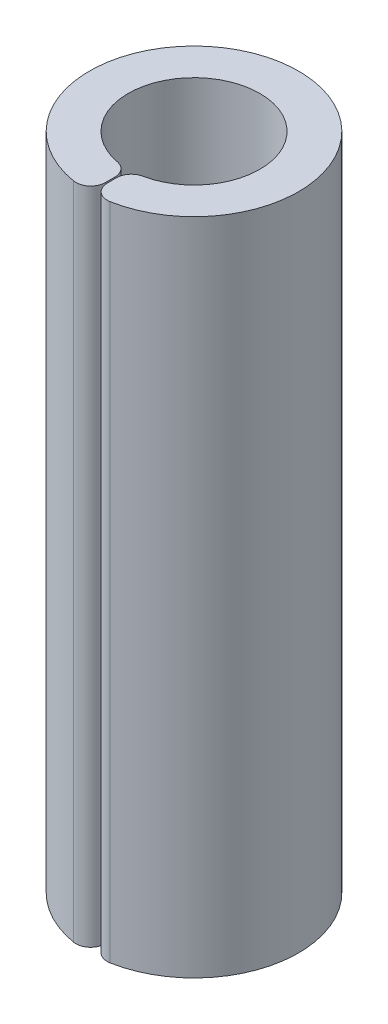
ISO-10303-21;
HEADER;
FILE_DESCRIPTION(('STEP AP214'),'2;1');
FILE_NAME('part.step','',(''),(''),'','','');
FILE_SCHEMA(('AUTOMOTIVE_DESIGN { 1 0 10303 214 1 1 1 1 }'));
ENDSEC;
DATA;
#1=APPLICATION_CONTEXT('core data for automotive mechanical design processes');
#2=APPLICATION_PROTOCOL_DEFINITION('international standard','automotive_design',2000,#1);
#3=PRODUCT_CONTEXT('',#1,'mechanical');
#4=PRODUCT('Part','Part','',(#3));
#5=PRODUCT_RELATED_PRODUCT_CATEGORY('part','',(#4));
#6=PRODUCT_DEFINITION_FORMATION('','',#4);
#7=PRODUCT_DEFINITION_CONTEXT('part definition',#1,'design');
#8=PRODUCT_DEFINITION('design','',#6,#7);
#9=PRODUCT_DEFINITION_SHAPE('','',#8);
#10=(LENGTH_UNIT() NAMED_UNIT(*) SI_UNIT(.MILLI.,.METRE.));
#11=(NAMED_UNIT(*) PLANE_ANGLE_UNIT() SI_UNIT($,.RADIAN.));
#12=(NAMED_UNIT(*) SI_UNIT($,.STERADIAN.) SOLID_ANGLE_UNIT());
#13=UNCERTAINTY_MEASURE_WITH_UNIT(LENGTH_MEASURE(1.E-05),#10,'distance_accuracy_value','');
#14=(GEOMETRIC_REPRESENTATION_CONTEXT(3) GLOBAL_UNCERTAINTY_ASSIGNED_CONTEXT((#13)) GLOBAL_UNIT_ASSIGNED_CONTEXT((#10,
#11,#12)) REPRESENTATION_CONTEXT('',''));
#15=CARTESIAN_POINT('',(0.,0.,0.));
#16=DIRECTION('',(0.,0.,1.));
#17=DIRECTION('',(1.,0.,0.));
#18=AXIS2_PLACEMENT_3D('',#15,#16,#17);
#19=CARTESIAN_POINT('',(0.,26.8,0.));
#20=DIRECTION('',(0.,-1.,0.));
#21=DIRECTION('',(0.,0.,-1.));
#22=AXIS2_PLACEMENT_3D('',#19,#20,#21);
#23=CYLINDRICAL_SURFACE('',#22,2.675);
#24=CARTESIAN_POINT('',(0.,0.,0.));
#25=DIRECTION('',(0.,-1.,0.));
#26=DIRECTION('',(0.,0.,1.));
#27=AXIS2_PLACEMENT_3D('',#24,#25,#26);
#28=CIRCLE('',#27,2.675);
#29=CARTESIAN_POINT('',(-0.490076335877863,0.,2.62972435532938));
#30=VERTEX_POINT('',#29);
#31=CARTESIAN_POINT('',(0.535896713145402,0.,2.62077082417367));
#32=VERTEX_POINT('',#31);
#33=EDGE_CURVE('E129',#30,#32,#28,.T.);
#34=ORIENTED_EDGE('',*,*,#33,.T.);
#35=DIRECTION('',(0.,-1.,0.));
#36=VECTOR('',#35,1.);
#37=CARTESIAN_POINT('',(0.535896713145402,26.8,2.62077082417367));
#38=LINE('',#37,#36);
#39=CARTESIAN_POINT('',(0.535896713145402,26.8,2.62077082417367));
#40=VERTEX_POINT('',#39);
#41=EDGE_CURVE('E11',#32,#40,#38,.F.);
#42=ORIENTED_EDGE('',*,*,#41,.T.);
#43=CARTESIAN_POINT('',(0.,26.8,0.));
#44=DIRECTION('',(0.,-1.,0.));
#45=DIRECTION('',(0.,0.,1.));
#46=AXIS2_PLACEMENT_3D('',#43,#44,#45);
#47=CIRCLE('',#46,2.675);
#48=CARTESIAN_POINT('',(-0.490076335877863,26.8,2.62972435532938));
#49=VERTEX_POINT('',#48);
#50=EDGE_CURVE('E127',#49,#40,#47,.T.);
#51=ORIENTED_EDGE('',*,*,#50,.F.);
#52=DIRECTION('',(0.,-1.,0.));
#53=VECTOR('',#52,1.);
#54=CARTESIAN_POINT('',(-0.490076335877863,26.8,2.62972435532938));
#55=LINE('',#54,#53);
#56=EDGE_CURVE('E41',#49,#30,#55,.T.);
#57=ORIENTED_EDGE('',*,*,#56,.T.);
#58=EDGE_LOOP('',(#34,#42,#51,#57));
#59=FACE_BOUND('',#58,.T.);
#60=ADVANCED_FACE('F33',(#59),#23,.F.);
#61=CARTESIAN_POINT('',(0.0466851872197338,26.8,2.67459258454335));
#62=DIRECTION('',(0.999847695156391,0.,-0.0174524064372837));
#63=DIRECTION('',(-0.0174524064372837,0.,-0.999847695156391));
#64=AXIS2_PLACEMENT_3D('',#61,#62,#63);
#65=PLANE('',#64);
#66=DIRECTION('',(0.0174524064372837,0.,0.999847695156391));
#67=VECTOR('',#66,1.);
#68=CARTESIAN_POINT('',(0.0466851872197338,0.,2.67459258454335));
#69=LINE('',#68,#67);
#70=CARTESIAN_POINT('',(0.0561892279720319,0.,3.21907871457967));
#71=VERTEX_POINT('',#70);
#72=CARTESIAN_POINT('',(0.062834722745357,0.,3.59979885516087));
#73=VERTEX_POINT('',#72);
#74=EDGE_CURVE('E125',#71,#73,#69,.T.);
#75=ORIENTED_EDGE('',*,*,#74,.T.);
#76=DIRECTION('',(0.,-1.,0.));
#77=VECTOR('',#76,1.);
#78=CARTESIAN_POINT('',(0.062834722745357,26.8,3.59979885516087));
#79=LINE('',#78,#77);
#80=CARTESIAN_POINT('',(0.062834722745357,26.8,3.59979885516087));
#81=VERTEX_POINT('',#80);
#82=EDGE_CURVE('E104',#73,#81,#79,.F.);
#83=ORIENTED_EDGE('',*,*,#82,.T.);
#84=DIRECTION('',(0.0174524064372837,0.,0.999847695156391));
#85=VECTOR('',#84,1.);
#86=CARTESIAN_POINT('',(0.0466851872197338,26.8,2.67459258454335));
#87=LINE('',#86,#85);
#88=CARTESIAN_POINT('',(0.0561892279720319,26.8,3.21907871457967));
#89=VERTEX_POINT('',#88);
#90=EDGE_CURVE('E165',#89,#81,#87,.T.);
#91=ORIENTED_EDGE('',*,*,#90,.F.);
#92=DIRECTION('',(0.,-1.,0.));
#93=VECTOR('',#92,1.);
#94=CARTESIAN_POINT('',(0.0561892279720319,26.8,3.21907871457967));
#95=LINE('',#94,#93);
#96=EDGE_CURVE('E109',#89,#71,#95,.T.);
#97=ORIENTED_EDGE('',*,*,#96,.T.);
#98=EDGE_LOOP('',(#75,#83,#91,#97));
#99=FACE_BOUND('',#98,.T.);
#100=ADVANCED_FACE('F175',(#99),#65,.F.);
#101=CARTESIAN_POINT('',(0.,26.8,0.));
#102=DIRECTION('',(0.,-1.,0.));
#103=DIRECTION('',(0.,0.,-1.));
#104=AXIS2_PLACEMENT_3D('',#101,#102,#103);
#105=CYLINDRICAL_SURFACE('',#104,4.25);
#106=CARTESIAN_POINT('',(0.,26.8,0.));
#107=DIRECTION('',(0.,1.,0.));
#108=DIRECTION('',(0.,0.,1.));
#109=AXIS2_PLACEMENT_3D('',#106,#107,#108);
#110=CIRCLE('',#109,4.25);
#111=CARTESIAN_POINT('',(0.771687450497688,26.8,4.1793538350736));
#112=VERTEX_POINT('',#111);
#113=CARTESIAN_POINT('',(-0.698630136986302,26.8,4.19218510227));
#114=VERTEX_POINT('',#113);
#115=EDGE_CURVE('E118',#112,#114,#110,.T.);
#116=ORIENTED_EDGE('',*,*,#115,.F.);
#117=DIRECTION('',(0.,-1.,0.));
#118=VECTOR('',#117,1.);
#119=CARTESIAN_POINT('',(0.771687450497688,26.8,4.1793538350736));
#120=LINE('',#119,#118);
#121=CARTESIAN_POINT('',(0.771687450497688,0.,4.1793538350736));
#122=VERTEX_POINT('',#121);
#123=EDGE_CURVE('E103',#112,#122,#120,.T.);
#124=ORIENTED_EDGE('',*,*,#123,.T.);
#125=CARTESIAN_POINT('',(0.,0.,0.));
#126=DIRECTION('',(0.,1.,0.));
#127=DIRECTION('',(0.,0.,1.));
#128=AXIS2_PLACEMENT_3D('',#125,#126,#127);
#129=CIRCLE('',#128,4.25);
#130=CARTESIAN_POINT('',(-0.698630136986302,0.,4.19218510227));
#131=VERTEX_POINT('',#130);
#132=EDGE_CURVE('E116',#122,#131,#129,.T.);
#133=ORIENTED_EDGE('',*,*,#132,.T.);
#134=DIRECTION('',(0.,-1.,0.));
#135=VECTOR('',#134,1.);
#136=CARTESIAN_POINT('',(-0.698630136986302,26.8,4.19218510227));
#137=LINE('',#136,#135);
#138=EDGE_CURVE('E120',#131,#114,#137,.F.);
#139=ORIENTED_EDGE('',*,*,#138,.T.);
#140=EDGE_LOOP('',(#116,#124,#133,#139));
#141=FACE_BOUND('',#140,.T.);
#142=ADVANCED_FACE('F115',(#141),#105,.T.);
#143=CARTESIAN_POINT('',(0.,26.8,2.675));
#144=DIRECTION('',(-1.,0.,0.));
#145=DIRECTION('',(0.,0.,1.));
#146=AXIS2_PLACEMENT_3D('',#143,#144,#145);
#147=PLANE('',#146);
#148=DIRECTION('',(0.,0.,-1.));
#149=VECTOR('',#148,1.);
#150=CARTESIAN_POINT('',(0.,26.8,2.675));
#151=LINE('',#150,#149);
#152=CARTESIAN_POINT('',(0.,26.8,3.60034720547894));
#153=VERTEX_POINT('',#152);
#154=CARTESIAN_POINT('',(0.,26.8,3.21956907054345));
#155=VERTEX_POINT('',#154);
#156=EDGE_CURVE('E133',#153,#155,#151,.T.);
#157=ORIENTED_EDGE('',*,*,#156,.F.);
#158=DIRECTION('',(0.,-1.,0.));
#159=VECTOR('',#158,1.);
#160=CARTESIAN_POINT('',(0.,26.8,3.60034720547894));
#161=LINE('',#160,#159);
#162=CARTESIAN_POINT('',(0.,0.,3.60034720547894));
#163=VERTEX_POINT('',#162);
#164=EDGE_CURVE('E150',#153,#163,#161,.T.);
#165=ORIENTED_EDGE('',*,*,#164,.T.);
#166=DIRECTION('',(0.,0.,-1.));
#167=VECTOR('',#166,1.);
#168=CARTESIAN_POINT('',(0.,0.,2.675));
#169=LINE('',#168,#167);
#170=CARTESIAN_POINT('',(0.,0.,3.21956907054345));
#171=VERTEX_POINT('',#170);
#172=EDGE_CURVE('E124',#163,#171,#169,.T.);
#173=ORIENTED_EDGE('',*,*,#172,.T.);
#174=DIRECTION('',(0.,-1.,0.));
#175=VECTOR('',#174,1.);
#176=CARTESIAN_POINT('',(0.,26.8,3.21956907054345));
#177=LINE('',#176,#175);
#178=EDGE_CURVE('E48',#171,#155,#177,.F.);
#179=ORIENTED_EDGE('',*,*,#178,.T.);
#180=EDGE_LOOP('',(#157,#165,#173,#179));
#181=FACE_BOUND('',#180,.T.);
#182=ADVANCED_FACE('F179',(#181),#147,.F.);
#183=CARTESIAN_POINT('',(0.,26.8,0.));
#184=DIRECTION('',(0.,1.,0.));
#185=DIRECTION('',(0.,0.,1.));
#186=AXIS2_PLACEMENT_3D('',#183,#184,#185);
#187=PLANE('',#186);
#188=ORIENTED_EDGE('',*,*,#90,.T.);
#189=CARTESIAN_POINT('',(0.662743339839191,26.8,3.5893274112985));
#190=DIRECTION('',(0.,1.,0.));
#191=DIRECTION('',(0.,0.,1.));
#192=AXIS2_PLACEMENT_3D('',#189,#190,#191);
#193=CIRCLE('',#192,0.6);
#194=EDGE_CURVE('E147',#81,#112,#193,.T.);
#195=ORIENTED_EDGE('',*,*,#194,.T.);
#196=ORIENTED_EDGE('',*,*,#115,.T.);
#197=CARTESIAN_POINT('',(-0.6,26.8,3.60034720547894));
#198=DIRECTION('',(0.,1.,0.));
#199=DIRECTION('',(0.,0.,1.));
#200=AXIS2_PLACEMENT_3D('',#197,#198,#199);
#201=CIRCLE('',#200,0.6);
#202=EDGE_CURVE('E55',#114,#153,#201,.T.);
#203=ORIENTED_EDGE('',*,*,#202,.T.);
#204=ORIENTED_EDGE('',*,*,#156,.T.);
#205=CARTESIAN_POINT('',(-0.6,26.8,3.21956907054345));
#206=DIRECTION('',(0.,1.,0.));
#207=DIRECTION('',(0.,0.,1.));
#208=AXIS2_PLACEMENT_3D('',#205,#206,#207);
#209=CIRCLE('',#208,0.6);
#210=EDGE_CURVE('E142',#155,#49,#209,.T.);
#211=ORIENTED_EDGE('',*,*,#210,.T.);
#212=ORIENTED_EDGE('',*,*,#50,.T.);
#213=CARTESIAN_POINT('',(0.656097845065866,26.8,3.2086072707173));
#214=DIRECTION('',(0.,1.,0.));
#215=DIRECTION('',(0.,0.,1.));
#216=AXIS2_PLACEMENT_3D('',#213,#214,#215);
#217=CIRCLE('',#216,0.6);
#218=EDGE_CURVE('E144',#40,#89,#217,.T.);
#219=ORIENTED_EDGE('',*,*,#218,.T.);
#220=EDGE_LOOP('',(#188,#195,#196,#203,#204,#211,#212,#219));
#221=FACE_BOUND('',#220,.T.);
#222=ADVANCED_FACE('F169',(#221),#187,.T.);
#223=CARTESIAN_POINT('',(0.,0.,0.));
#224=DIRECTION('',(0.,1.,0.));
#225=DIRECTION('',(0.,0.,1.));
#226=AXIS2_PLACEMENT_3D('',#223,#224,#225);
#227=PLANE('',#226);
#228=ORIENTED_EDGE('',*,*,#132,.F.);
#229=CARTESIAN_POINT('',(0.662743339839191,0.,3.5893274112985));
#230=DIRECTION('',(0.,1.,0.));
#231=DIRECTION('',(0.,0.,1.));
#232=AXIS2_PLACEMENT_3D('',#229,#230,#231);
#233=CIRCLE('',#232,0.6);
#234=EDGE_CURVE('E99',#122,#73,#233,.F.);
#235=ORIENTED_EDGE('',*,*,#234,.T.);
#236=ORIENTED_EDGE('',*,*,#74,.F.);
#237=CARTESIAN_POINT('',(0.656097845065866,0.,3.2086072707173));
#238=DIRECTION('',(0.,1.,0.));
#239=DIRECTION('',(0.,0.,1.));
#240=AXIS2_PLACEMENT_3D('',#237,#238,#239);
#241=CIRCLE('',#240,0.6);
#242=EDGE_CURVE('E136',#71,#32,#241,.F.);
#243=ORIENTED_EDGE('',*,*,#242,.T.);
#244=ORIENTED_EDGE('',*,*,#33,.F.);
#245=CARTESIAN_POINT('',(-0.6,0.,3.21956907054345));
#246=DIRECTION('',(0.,1.,0.));
#247=DIRECTION('',(0.,0.,1.));
#248=AXIS2_PLACEMENT_3D('',#245,#246,#247);
#249=CIRCLE('',#248,0.6);
#250=EDGE_CURVE('E119',#30,#171,#249,.F.);
#251=ORIENTED_EDGE('',*,*,#250,.T.);
#252=ORIENTED_EDGE('',*,*,#172,.F.);
#253=CARTESIAN_POINT('',(-0.6,0.,3.60034720547894));
#254=DIRECTION('',(0.,1.,0.));
#255=DIRECTION('',(0.,0.,1.));
#256=AXIS2_PLACEMENT_3D('',#253,#254,#255);
#257=CIRCLE('',#256,0.6);
#258=EDGE_CURVE('E110',#163,#131,#257,.F.);
#259=ORIENTED_EDGE('',*,*,#258,.T.);
#260=EDGE_LOOP('',(#228,#235,#236,#243,#244,#251,#252,#259));
#261=FACE_BOUND('',#260,.T.);
#262=ADVANCED_FACE('F122',(#261),#227,.F.);
#263=CARTESIAN_POINT('',(0.662743339839191,26.8,3.5893274112985));
#264=DIRECTION('',(0.,-1.,0.));
#265=DIRECTION('',(0.,0.,-1.));
#266=AXIS2_PLACEMENT_3D('',#263,#264,#265);
#267=CYLINDRICAL_SURFACE('',#266,0.6);
#268=ORIENTED_EDGE('',*,*,#194,.F.);
#269=ORIENTED_EDGE('',*,*,#82,.F.);
#270=ORIENTED_EDGE('',*,*,#234,.F.);
#271=ORIENTED_EDGE('',*,*,#123,.F.);
#272=EDGE_LOOP('',(#268,#269,#270,#271));
#273=FACE_BOUND('',#272,.T.);
#274=ADVANCED_FACE('F102',(#273),#267,.T.);
#275=CARTESIAN_POINT('',(-0.6,26.8,3.60034720547894));
#276=DIRECTION('',(0.,-1.,0.));
#277=DIRECTION('',(0.,0.,-1.));
#278=AXIS2_PLACEMENT_3D('',#275,#276,#277);
#279=CYLINDRICAL_SURFACE('',#278,0.6);
#280=ORIENTED_EDGE('',*,*,#202,.F.);
#281=ORIENTED_EDGE('',*,*,#138,.F.);
#282=ORIENTED_EDGE('',*,*,#258,.F.);
#283=ORIENTED_EDGE('',*,*,#164,.F.);
#284=EDGE_LOOP('',(#280,#281,#282,#283));
#285=FACE_BOUND('',#284,.T.);
#286=ADVANCED_FACE('F178',(#285),#279,.T.);
#287=CARTESIAN_POINT('',(0.656097845065866,26.8,3.2086072707173));
#288=DIRECTION('',(0.,-1.,0.));
#289=DIRECTION('',(0.,0.,-1.));
#290=AXIS2_PLACEMENT_3D('',#287,#288,#289);
#291=CYLINDRICAL_SURFACE('',#290,0.6);
#292=ORIENTED_EDGE('',*,*,#218,.F.);
#293=ORIENTED_EDGE('',*,*,#41,.F.);
#294=ORIENTED_EDGE('',*,*,#242,.F.);
#295=ORIENTED_EDGE('',*,*,#96,.F.);
#296=EDGE_LOOP('',(#292,#293,#294,#295));
#297=FACE_BOUND('',#296,.T.);
#298=ADVANCED_FACE('F173',(#297),#291,.T.);
#299=CARTESIAN_POINT('',(-0.6,26.8,3.21956907054345));
#300=DIRECTION('',(0.,-1.,0.));
#301=DIRECTION('',(0.,0.,-1.));
#302=AXIS2_PLACEMENT_3D('',#299,#300,#301);
#303=CYLINDRICAL_SURFACE('',#302,0.6);
#304=ORIENTED_EDGE('',*,*,#210,.F.);
#305=ORIENTED_EDGE('',*,*,#178,.F.);
#306=ORIENTED_EDGE('',*,*,#250,.F.);
#307=ORIENTED_EDGE('',*,*,#56,.F.);
#308=EDGE_LOOP('',(#304,#305,#306,#307));
#309=FACE_BOUND('',#308,.T.);
#310=ADVANCED_FACE('F35',(#309),#303,.T.);
#311=CLOSED_SHELL('',(#60,#100,#142,#182,#222,#262,#274,#286,#298,#310));
#312=MANIFOLD_SOLID_BREP('B2',#311);
#313=ADVANCED_BREP_SHAPE_REPRESENTATION('',(#18,#312),#14);
#314=SHAPE_DEFINITION_REPRESENTATION(#9,#313);
ENDSEC;
END-ISO-10303-21;
